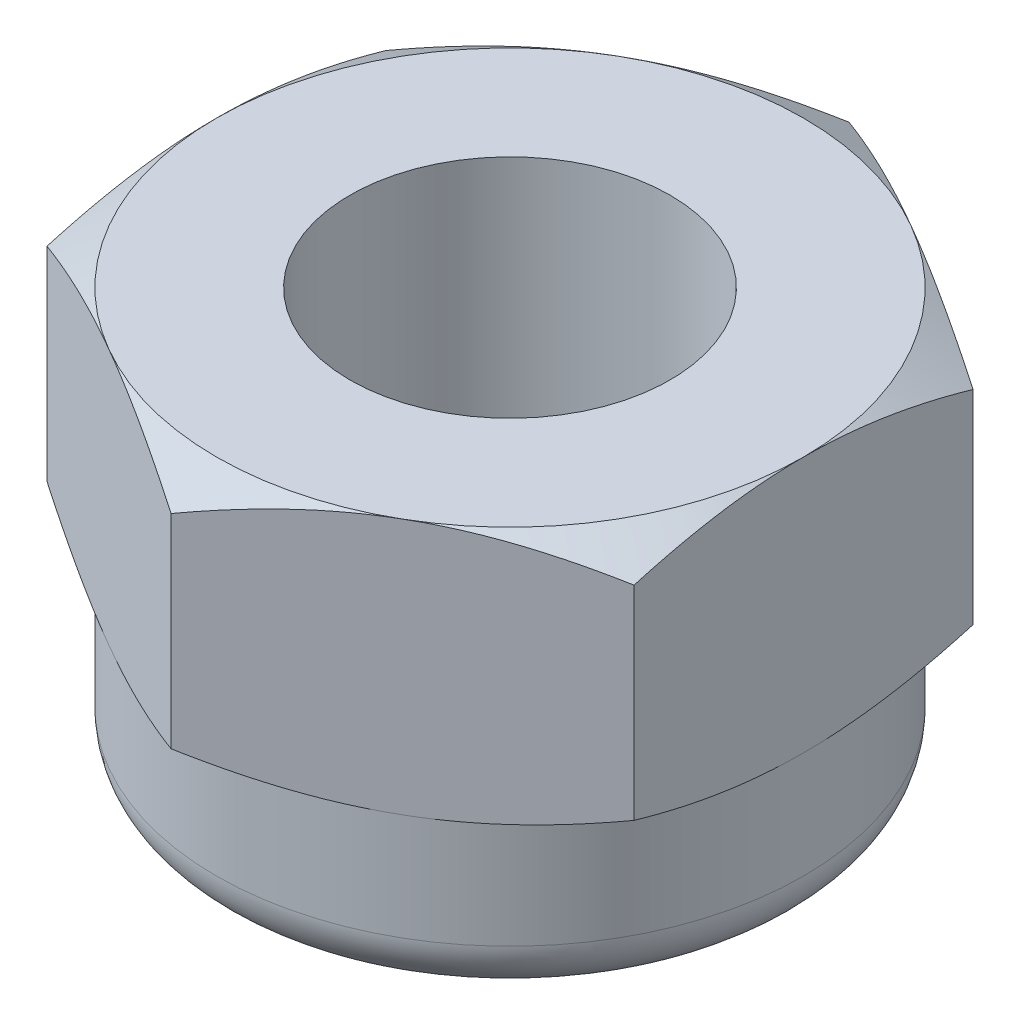
ISO-10303-21;
HEADER;
FILE_DESCRIPTION(('STEP AP214'),'2;1');
FILE_NAME('part.step','',(''),(''),'','','');
FILE_SCHEMA(('AUTOMOTIVE_DESIGN { 1 0 10303 214 1 1 1 1 }'));
ENDSEC;
DATA;
#1=APPLICATION_CONTEXT('core data for automotive mechanical design processes');
#2=APPLICATION_PROTOCOL_DEFINITION('international standard','automotive_design',2000,#1);
#3=PRODUCT_CONTEXT('',#1,'mechanical');
#4=PRODUCT('Part','Part','',(#3));
#5=PRODUCT_RELATED_PRODUCT_CATEGORY('part','',(#4));
#6=PRODUCT_DEFINITION_FORMATION('','',#4);
#7=PRODUCT_DEFINITION_CONTEXT('part definition',#1,'design');
#8=PRODUCT_DEFINITION('design','',#6,#7);
#9=PRODUCT_DEFINITION_SHAPE('','',#8);
#10=(LENGTH_UNIT() NAMED_UNIT(*) SI_UNIT(.MILLI.,.METRE.));
#11=(NAMED_UNIT(*) PLANE_ANGLE_UNIT() SI_UNIT($,.RADIAN.));
#12=(NAMED_UNIT(*) SI_UNIT($,.STERADIAN.) SOLID_ANGLE_UNIT());
#13=UNCERTAINTY_MEASURE_WITH_UNIT(LENGTH_MEASURE(1.E-05),#10,'distance_accuracy_value','');
#14=(GEOMETRIC_REPRESENTATION_CONTEXT(3) GLOBAL_UNCERTAINTY_ASSIGNED_CONTEXT((#13)) GLOBAL_UNIT_ASSIGNED_CONTEXT((#10,
#11,#12)) REPRESENTATION_CONTEXT('',''));
#15=CARTESIAN_POINT('',(0.,0.,0.));
#16=DIRECTION('',(0.,0.,1.));
#17=DIRECTION('',(1.,0.,0.));
#18=AXIS2_PLACEMENT_3D('',#15,#16,#17);
#19=CARTESIAN_POINT('',(2.75,2.4,1.58771324027147));
#20=DIRECTION('',(-1.,0.,0.));
#21=DIRECTION('',(0.,0.,1.));
#22=AXIS2_PLACEMENT_3D('',#19,#20,#21);
#23=PLANE('',#22);
#24=CARTESIAN_POINT('',(2.75,1.38093653958842,-4.34466851973618));
#25=CARTESIAN_POINT('',(2.75,1.32202064950724,-4.22386779698329));
#26=CARTESIAN_POINT('',(2.75,1.26364700999931,-4.10279820576392));
#27=CARTESIAN_POINT('',(2.75,1.1482876774291,-3.85997860192461));
#28=CARTESIAN_POINT('',(2.75,1.09130218842708,-3.73822849246315));
#29=CARTESIAN_POINT('',(2.75,0.978752723293784,-3.49331526441921));
#30=CARTESIAN_POINT('',(2.75,0.923197515155514,-3.37014810316777));
#31=CARTESIAN_POINT('',(2.75,0.814256244023592,-3.12286173431569));
#32=CARTESIAN_POINT('',(2.75,0.760870083644362,-2.99874256975606));
#33=CARTESIAN_POINT('',(2.75,0.655040057447402,-2.74504756832828));
#34=CARTESIAN_POINT('',(2.75,0.602692465793723,-2.61543135851998));
#35=CARTESIAN_POINT('',(2.75,0.501769184528042,-2.3547122248499));
#36=CARTESIAN_POINT('',(2.75,0.453193906922891,-2.22360914038081));
#37=CARTESIAN_POINT('',(2.75,0.361032320926382,-1.95992838631145));
#38=CARTESIAN_POINT('',(2.75,0.317436563028728,-1.82735405172156));
#39=CARTESIAN_POINT('',(2.75,0.236579903230571,-1.56030503468424));
#40=CARTESIAN_POINT('',(2.75,0.19931708834281,-1.42583093943772));
#41=CARTESIAN_POINT('',(2.75,0.133064720744649,-1.15567205992232));
#42=CARTESIAN_POINT('',(2.75,0.104027276748661,-1.01999923443433));
#43=CARTESIAN_POINT('',(2.75,0.0558064271323424,-0.746885455758029));
#44=CARTESIAN_POINT('',(2.75,0.0366219648340762,-0.60944469379236));
#45=CARTESIAN_POINT('',(2.75,0.00988438809777795,-0.335308015782439));
#46=CARTESIAN_POINT('',(2.75,0.00217562219202478,-0.198627665157731));
#47=CARTESIAN_POINT('',(2.75,-0.00137225152806838,0.0749013422897881));
#48=CARTESIAN_POINT('',(2.75,0.00278868640387943,0.211749999759228));
#49=CARTESIAN_POINT('',(2.75,0.0194575166846124,0.441773738270723));
#50=CARTESIAN_POINT('',(2.75,0.0289378796806115,0.535183717161858));
#51=CARTESIAN_POINT('',(2.75,0.0528801300146092,0.721369109747204));
#52=CARTESIAN_POINT('',(2.75,0.0673426297137115,0.814144444006141));
#53=CARTESIAN_POINT('',(2.75,0.117450471333739,1.09135512594781));
#54=CARTESIAN_POINT('',(2.75,0.159808531169033,1.27458276750907));
#55=CARTESIAN_POINT('',(2.75,0.258901006196716,1.64148663937185));
#56=CARTESIAN_POINT('',(2.75,0.315943538456145,1.82507634432752));
#57=CARTESIAN_POINT('',(2.75,0.408810753757667,2.09789707107598));
#58=CARTESIAN_POINT('',(2.75,0.440981048739553,2.1884033337036));
#59=CARTESIAN_POINT('',(2.75,0.507377444516064,2.3686579485815));
#60=CARTESIAN_POINT('',(2.75,0.541603508874817,2.45840631423238));
#61=CARTESIAN_POINT('',(2.75,0.630917375568817,2.68603060571207));
#62=CARTESIAN_POINT('',(2.75,0.68719551496508,2.82343831755756));
#63=CARTESIAN_POINT('',(2.75,0.80288289071563,3.09693392822121));
#64=CARTESIAN_POINT('',(2.75,0.862292397407978,3.23302171188218));
#65=CARTESIAN_POINT('',(2.75,0.983551766352992,3.50414955291982));
#66=CARTESIAN_POINT('',(2.75,1.04540233123311,3.63918929504804));
#67=CARTESIAN_POINT('',(2.75,1.17101091756355,3.90838031374438));
#68=CARTESIAN_POINT('',(2.75,1.23476899108964,4.04253156593401));
#69=CARTESIAN_POINT('',(2.75,1.42847314195054,4.44426655928707));
#70=CARTESIAN_POINT('',(2.75,1.56067980896763,4.71075917718014));
#71=CARTESIAN_POINT('',(2.75,1.82899066695537,5.24170253784736));
#72=CARTESIAN_POINT('',(2.75,1.96509418383273,5.50615362384513));
#73=CARTESIAN_POINT('',(2.75,2.22681256839317,6.00831212761472));
#74=CARTESIAN_POINT('',(2.75,2.35217952114007,6.24614899547915));
#75=CARTESIAN_POINT('',(2.75,2.60455330317852,6.72096498096079));
#76=CARTESIAN_POINT('',(2.75,2.73156021492778,6.95794405467475));
#77=CARTESIAN_POINT('',(2.75,2.98641132805265,7.43050913308615));
#78=CARTESIAN_POINT('',(2.75,3.11425174665986,7.66609718039577));
#79=CARTESIAN_POINT('',(2.75,3.37088488435897,8.13673291173544));
#80=CARTESIAN_POINT('',(2.75,3.49967753635213,8.37178063233783));
#81=CARTESIAN_POINT('',(2.75,3.62882004293521,8.60663456203462));
#82=B_SPLINE_CURVE_WITH_KNOTS('',3,(#24,#25,#26,#27,#28,#29,#30,#31,#32,#33,#34,#35,#36,#37,#38,
#39,#40,#41,#42,#43,#44,#45,#46,#47,#48,#49,#50,#51,#52,#53,#54,#55,#56,#57,#58,#59,#60,#61,#62,
#63,#64,#65,#66,#67,#68,#69,#70,#71,#72,#73,#74,#75,#76,#77,#78,#79,#80,#81),.UNSPECIFIED.,.F.,
.F.,(4,2,2,2,2,2,2,2,2,2,2,2,2,2,2,2,2,2,2,2,2,2,2,2,2,2,2,2,4),(0.,0.403210544384673,
0.806480007959045,1.21181340797903,1.61712858924554,2.03644659555967,2.45581033497737,
2.87436455094914,3.29279210898127,3.70873084748665,4.1246249695373,4.53482498455775,
4.94502658050672,5.22656210678562,5.50813224932743,6.07154932122723,6.64791901572732,
6.93606075698111,7.22419739279862,7.66960137467362,8.11504387247217,8.56061553390865,
9.00619937075532,9.89859388845236,10.7908349577555,11.5973926448137,12.4039910450292,
13.2081055813639,14.0121639860803),.UNSPECIFIED.);
#83=CARTESIAN_POINT('',(2.75,0.2456200930618,-1.58771324027157));
#84=VERTEX_POINT('',#83);
#85=CARTESIAN_POINT('',(2.75,0.,0.));
#86=VERTEX_POINT('',#85);
#87=EDGE_CURVE('E150',#84,#86,#82,.T.);
#88=ORIENTED_EDGE('',*,*,#87,.F.);
#89=DIRECTION('',(0.,-1.,0.));
#90=VECTOR('',#89,1.);
#91=CARTESIAN_POINT('',(2.75,2.4,-1.58771324027147));
#92=LINE('',#91,#90);
#93=CARTESIAN_POINT('',(2.75,2.15437990693814,-1.58771324027147));
#94=VERTEX_POINT('',#93);
#95=EDGE_CURVE('E159',#94,#84,#92,.T.);
#96=ORIENTED_EDGE('',*,*,#95,.F.);
#97=CARTESIAN_POINT('',(2.75,1.0190634604116,-4.34466851973617));
#98=CARTESIAN_POINT('',(2.75,1.07797935049279,-4.22386779698328));
#99=CARTESIAN_POINT('',(2.75,1.13635299000071,-4.10279820576391));
#100=CARTESIAN_POINT('',(2.75,1.25171232257092,-3.8599786019246));
#101=CARTESIAN_POINT('',(2.75,1.30869781157294,-3.73822849246315));
#102=CARTESIAN_POINT('',(2.75,1.42124727670624,-3.4933152644192));
#103=CARTESIAN_POINT('',(2.75,1.4768024848445,-3.37014810316777));
#104=CARTESIAN_POINT('',(2.75,1.58574375597643,-3.12286173431569));
#105=CARTESIAN_POINT('',(2.75,1.63912991635565,-2.99874256975605));
#106=CARTESIAN_POINT('',(2.75,1.74495994255261,-2.74504756832828));
#107=CARTESIAN_POINT('',(2.75,1.79730753420629,-2.61543135851997));
#108=CARTESIAN_POINT('',(2.75,1.89823081547197,-2.35471222484989));
#109=CARTESIAN_POINT('',(2.75,1.94680609307712,-2.22360914038081));
#110=CARTESIAN_POINT('',(2.75,2.03896767907362,-1.95992838631144));
#111=CARTESIAN_POINT('',(2.75,2.08256343697128,-1.82735405172156));
#112=CARTESIAN_POINT('',(2.75,2.16342009676943,-1.56030503468424));
#113=CARTESIAN_POINT('',(2.75,2.20068291165719,-1.42583093943771));
#114=CARTESIAN_POINT('',(2.75,2.26693527925535,-1.15567205992232));
#115=CARTESIAN_POINT('',(2.75,2.29597272325134,-1.01999923443432));
#116=CARTESIAN_POINT('',(2.75,2.34419357286766,-0.746885455758027));
#117=CARTESIAN_POINT('',(2.75,2.36337803516592,-0.609444693792358));
#118=CARTESIAN_POINT('',(2.75,2.39011561190222,-0.335308015782438));
#119=CARTESIAN_POINT('',(2.75,2.39782437780797,-0.198627665157731));
#120=CARTESIAN_POINT('',(2.75,2.40137225152807,0.0749013422897874));
#121=CARTESIAN_POINT('',(2.75,2.39721131359612,0.211749999759227));
#122=CARTESIAN_POINT('',(2.75,2.38054248331539,0.441773738270724));
#123=CARTESIAN_POINT('',(2.75,2.37106212031939,0.53518371716186));
#124=CARTESIAN_POINT('',(2.75,2.34711986998539,0.72136910974721));
#125=CARTESIAN_POINT('',(2.75,2.33265737028629,0.81414444400615));
#126=CARTESIAN_POINT('',(2.75,2.28254952866626,1.09135512594783));
#127=CARTESIAN_POINT('',(2.75,2.24019146883096,1.27458276750909));
#128=CARTESIAN_POINT('',(2.75,2.14109899380328,1.64148663937188));
#129=CARTESIAN_POINT('',(2.75,2.08405646154385,1.82507634432755));
#130=CARTESIAN_POINT('',(2.75,1.99118924624233,2.09789707107601));
#131=CARTESIAN_POINT('',(2.75,1.95901895126044,2.18840333370364));
#132=CARTESIAN_POINT('',(2.75,1.89262255548393,2.36865794858154));
#133=CARTESIAN_POINT('',(2.75,1.85839649112518,2.45840631423243));
#134=CARTESIAN_POINT('',(2.75,1.76908262443118,2.68603060571212));
#135=CARTESIAN_POINT('',(2.75,1.71280448503491,2.82343831755761));
#136=CARTESIAN_POINT('',(2.75,1.59711710928437,3.09693392822125));
#137=CARTESIAN_POINT('',(2.75,1.53770760259202,3.23302171188222));
#138=CARTESIAN_POINT('',(2.75,1.41644823364701,3.50414955291986));
#139=CARTESIAN_POINT('',(2.75,1.35459766876689,3.63918929504808));
#140=CARTESIAN_POINT('',(2.75,1.22898908243645,3.90838031374441));
#141=CARTESIAN_POINT('',(2.75,1.16523100891036,4.04253156593405));
#142=CARTESIAN_POINT('',(2.75,0.971526858049471,4.44426655928711));
#143=CARTESIAN_POINT('',(2.75,0.839320191032382,4.71075917718017));
#144=CARTESIAN_POINT('',(2.75,0.571009333044648,5.24170253784739));
#145=CARTESIAN_POINT('',(2.75,0.434905816167286,5.50615362384516));
#146=CARTESIAN_POINT('',(2.75,0.173187431606851,6.00831212761475));
#147=CARTESIAN_POINT('',(2.75,0.0478204788599523,6.24614899547918));
#148=CARTESIAN_POINT('',(2.75,-0.204553303178489,6.72096498096082));
#149=CARTESIAN_POINT('',(2.75,-0.331560214927753,6.95794405467478));
#150=CARTESIAN_POINT('',(2.75,-0.58641132805262,7.43050913308618));
#151=CARTESIAN_POINT('',(2.75,-0.714251746659824,7.6660971803958));
#152=CARTESIAN_POINT('',(2.75,-0.970884884358933,8.13673291173547));
#153=CARTESIAN_POINT('',(2.75,-1.09967753635209,8.37178063233787));
#154=CARTESIAN_POINT('',(2.75,-1.22882004293517,8.60663456203465));
#155=B_SPLINE_CURVE_WITH_KNOTS('',3,(#97,#98,#99,#100,#101,#102,#103,#104,#105,#106,#107,#108,
#109,#110,#111,#112,#113,#114,#115,#116,#117,#118,#119,#120,#121,#122,#123,#124,#125,#126,#127,
#128,#129,#130,#131,#132,#133,#134,#135,#136,#137,#138,#139,#140,#141,#142,#143,#144,#145,#146,
#147,#148,#149,#150,#151,#152,#153,#154),.UNSPECIFIED.,.F.,.F.,(4,2,2,2,2,2,2,2,2,2,2,2,2,2,2,2,
2,2,2,2,2,2,2,2,2,2,2,2,4),(0.,0.403210544384672,0.806480007959044,1.21181340797902,
1.61712858924554,2.03644659555967,2.45581033497736,2.87436455094913,3.29279210898126,
3.70873084748664,4.12462496953729,4.53482498455774,4.94502658050671,5.22656210678561,
5.50813224932743,6.07154932122724,6.64791901572734,6.93606075698114,7.22419739279866,
7.66960137467366,8.1150438724722,8.56061553390868,9.00619937075534,9.89859388845238,
10.7908349577555,11.5973926448137,12.4039910450292,13.2081055813639,14.0121639860803),.UNSPECIFIED.);
#156=CARTESIAN_POINT('',(2.75,2.4,0.));
#157=VERTEX_POINT('',#156);
#158=EDGE_CURVE('E224',#157,#94,#155,.F.);
#159=ORIENTED_EDGE('',*,*,#158,.F.);
#160=CARTESIAN_POINT('',(2.75,2.15437990693814,1.58771324027147));
#161=VERTEX_POINT('',#160);
#162=EDGE_CURVE('E231',#161,#157,#155,.F.);
#163=ORIENTED_EDGE('',*,*,#162,.F.);
#164=DIRECTION('',(0.,-1.,0.));
#165=VECTOR('',#164,1.);
#166=CARTESIAN_POINT('',(2.75,2.4,1.58771324027147));
#167=LINE('',#166,#165);
#168=CARTESIAN_POINT('',(2.75,0.245620093061864,1.58771324027147));
#169=VERTEX_POINT('',#168);
#170=EDGE_CURVE('E242',#161,#169,#167,.T.);
#171=ORIENTED_EDGE('',*,*,#170,.T.);
#172=EDGE_CURVE('E214',#86,#169,#82,.T.);
#173=ORIENTED_EDGE('',*,*,#172,.F.);
#174=EDGE_LOOP('',(#88,#96,#159,#163,#171,#173));
#175=FACE_BOUND('',#174,.T.);
#176=ADVANCED_FACE('F38',(#175),#23,.F.);
#177=CARTESIAN_POINT('',(2.75,2.4,-1.58771324027147));
#178=DIRECTION('',(-0.5,0.,0.866025403784439));
#179=DIRECTION('',(0.866025403784439,0.,0.5));
#180=AXIS2_PLACEMENT_3D('',#177,#178,#179);
#181=PLANE('',#180);
#182=CARTESIAN_POINT('',(-0.000200000000000501,0.245686763364762,-3.17554195059678));
#183=CARTESIAN_POINT('',(0.120649220659906,0.205387662249264,-3.10576962051743));
#184=CARTESIAN_POINT('',(0.242541602622634,0.168736902597663,-3.03539502097908));
#185=CARTESIAN_POINT('',(0.488437126727893,0.104762182969802,-2.89342717394439));
#186=CARTESIAN_POINT('',(0.612444638573856,0.0774608556744981,-2.82183140359858));
#187=CARTESIAN_POINT('',(0.858922797975945,0.0349617452941173,-2.67952717191842));
#188=CARTESIAN_POINT('',(0.981355518587418,0.0194811186224583,-2.60884060771577));
#189=CARTESIAN_POINT('',(1.22679714236892,0.000999397369940745,-2.46713482015518));
#190=CARTESIAN_POINT('',(1.34980515323291,-0.00201700053740013,-2.39611611197037));
#191=CARTESIAN_POINT('',(1.57965878661079,0.0042531454285469,-2.26341005486544));
#192=CARTESIAN_POINT('',(1.68653879125402,0.0120001542767027,-2.20170285541369));
#193=CARTESIAN_POINT('',(1.89960246733475,0.0365551810643553,-2.07869048467395));
#194=CARTESIAN_POINT('',(2.00578540164889,0.053371589650571,-2.01738573896433));
#195=CARTESIAN_POINT('',(2.21928848939318,0.0954119223459572,-1.89411967378235));
#196=CARTESIAN_POINT('',(2.32658161614285,0.120814080687232,-1.83217395817123));
#197=CARTESIAN_POINT('',(2.53956747928405,0.178467225839983,-1.70920651275308));
#198=CARTESIAN_POINT('',(2.64526294502665,0.210704663298984,-1.64818320715446));
#199=CARTESIAN_POINT('',(2.7502,0.245686763364762,-1.58759777021763));
#200=B_SPLINE_CURVE_WITH_KNOTS('',3,(#182,#183,#184,#185,#186,#187,#188,#189,#190,#191,#192,
#193,#194,#195,#196,#197,#198,#199),.UNSPECIFIED.,.F.,.F.,(4,2,2,2,2,2,2,2,4),(0.,
0.435912828725889,0.872873557116333,1.29901931904672,1.72464171213574,2.09526089052938,
2.46622354066374,2.84541551798557,3.22386274754524),.UNSPECIFIED.);
#201=CARTESIAN_POINT('',(0.,0.245620093061864,-3.17542648054294));
#202=VERTEX_POINT('',#201);
#203=CARTESIAN_POINT('',(1.375,0.,-2.38156986040721));
#204=VERTEX_POINT('',#203);
#205=EDGE_CURVE('E137',#202,#204,#200,.T.);
#206=ORIENTED_EDGE('',*,*,#205,.F.);
#207=DIRECTION('',(0.,-1.,0.));
#208=VECTOR('',#207,1.);
#209=CARTESIAN_POINT('',(0.,2.4,-3.17542648054294));
#210=LINE('',#209,#208);
#211=CARTESIAN_POINT('',(0.,2.15437990693814,-3.17542648054294));
#212=VERTEX_POINT('',#211);
#213=EDGE_CURVE('E254',#212,#202,#210,.T.);
#214=ORIENTED_EDGE('',*,*,#213,.F.);
#215=CARTESIAN_POINT('',(2.7502,2.15431323663524,-1.58759777021763));
#216=CARTESIAN_POINT('',(2.62935077934009,2.19461233775074,-1.65737010029699));
#217=CARTESIAN_POINT('',(2.50745839737737,2.23126309740234,-1.72774469983533));
#218=CARTESIAN_POINT('',(2.26156287327211,2.2952378170302,-1.86971254687003));
#219=CARTESIAN_POINT('',(2.13755536142614,2.3225391443255,-1.94130831721583));
#220=CARTESIAN_POINT('',(1.89107720202406,2.36503825470588,-2.08361254889599));
#221=CARTESIAN_POINT('',(1.76864448141258,2.38051888137754,-2.15429911309864));
#222=CARTESIAN_POINT('',(1.52320285763109,2.39900060263006,-2.29600490065923));
#223=CARTESIAN_POINT('',(1.40019484676709,2.4020170005374,-2.36702360884404));
#224=CARTESIAN_POINT('',(1.17034121338921,2.39574685457145,-2.49972966594897));
#225=CARTESIAN_POINT('',(1.06346120874598,2.3879998457233,-2.56143686540073));
#226=CARTESIAN_POINT('',(0.850397532665251,2.36344481893564,-2.68444923614047));
#227=CARTESIAN_POINT('',(0.744214598351111,2.34662841034943,-2.74575398185008));
#228=CARTESIAN_POINT('',(0.530711510606816,2.30458807765404,-2.86902004703206));
#229=CARTESIAN_POINT('',(0.423418383857145,2.27918591931277,-2.93096576264318));
#230=CARTESIAN_POINT('',(0.210432520715948,2.22153277416002,-3.05393320806134));
#231=CARTESIAN_POINT('',(0.104737054973347,2.18929533670102,-3.11495651365995));
#232=CARTESIAN_POINT('',(-0.000200000000000682,2.15431323663524,-3.17554195059678));
#233=B_SPLINE_CURVE_WITH_KNOTS('',3,(#215,#216,#217,#218,#219,#220,#221,#222,#223,#224,#225,
#226,#227,#228,#229,#230,#231,#232),.UNSPECIFIED.,.F.,.F.,(4,2,2,2,2,2,2,2,4),(0.,
0.435912828725888,0.872873557116331,1.29901931904671,1.72464171213573,2.09526089052937,
2.46622354066374,2.84541551798557,3.22386274754524),.UNSPECIFIED.);
#234=CARTESIAN_POINT('',(1.375,2.4,-2.38156986040721));
#235=VERTEX_POINT('',#234);
#236=EDGE_CURVE('E233',#235,#212,#233,.T.);
#237=ORIENTED_EDGE('',*,*,#236,.F.);
#238=EDGE_CURVE('E232',#94,#235,#233,.T.);
#239=ORIENTED_EDGE('',*,*,#238,.F.);
#240=ORIENTED_EDGE('',*,*,#95,.T.);
#241=EDGE_CURVE('E145',#204,#84,#200,.T.);
#242=ORIENTED_EDGE('',*,*,#241,.F.);
#243=EDGE_LOOP('',(#206,#214,#237,#239,#240,#242));
#244=FACE_BOUND('',#243,.T.);
#245=ADVANCED_FACE('F156',(#244),#181,.F.);
#246=CARTESIAN_POINT('',(0.,2.4,-3.17542648054294));
#247=DIRECTION('',(0.5,0.,0.866025403784439));
#248=DIRECTION('',(0.866025403784439,0.,-0.5));
#249=AXIS2_PLACEMENT_3D('',#246,#247,#248);
#250=PLANE('',#249);
#251=CARTESIAN_POINT('',(-2.7502,0.245686763364762,-1.58759777021763));
#252=CARTESIAN_POINT('',(-2.62935077934009,0.205387662249264,-1.65737010029699));
#253=CARTESIAN_POINT('',(-2.50745839737737,0.168736902597663,-1.72774469983533));
#254=CARTESIAN_POINT('',(-2.26156287327211,0.104762182969802,-1.86971254687003));
#255=CARTESIAN_POINT('',(-2.13755536142614,0.0774608556744982,-1.94130831721583));
#256=CARTESIAN_POINT('',(-1.89107720202405,0.0349617452941174,-2.08361254889599));
#257=CARTESIAN_POINT('',(-1.76864448141258,0.0194811186224582,-2.15429911309864));
#258=CARTESIAN_POINT('',(-1.52320285763108,0.00099939736994089,-2.29600490065923));
#259=CARTESIAN_POINT('',(-1.40019484676709,-0.00201700053739971,-2.36702360884404));
#260=CARTESIAN_POINT('',(-1.1703412133892,0.0042531454285476,-2.49972966594897));
#261=CARTESIAN_POINT('',(-1.06346120874598,0.0120001542767034,-2.56143686540073));
#262=CARTESIAN_POINT('',(-0.850397532665249,0.036555181064356,-2.68444923614047));
#263=CARTESIAN_POINT('',(-0.744214598351109,0.0533715896505715,-2.74575398185008));
#264=CARTESIAN_POINT('',(-0.530711510606815,0.0954119223459576,-2.86902004703206));
#265=CARTESIAN_POINT('',(-0.423418383857144,0.120814080687232,-2.93096576264318));
#266=CARTESIAN_POINT('',(-0.210432520715949,0.178467225839983,-3.05393320806134));
#267=CARTESIAN_POINT('',(-0.104737054973347,0.210704663298984,-3.11495651365995));
#268=CARTESIAN_POINT('',(0.000199999999999406,0.245686763364762,-3.17554195059678));
#269=B_SPLINE_CURVE_WITH_KNOTS('',3,(#251,#252,#253,#254,#255,#256,#257,#258,#259,#260,#261,
#262,#263,#264,#265,#266,#267,#268),.UNSPECIFIED.,.F.,.F.,(4,2,2,2,2,2,2,2,4),(0.,
0.435912828725889,0.872873557116334,1.29901931904672,1.72464171213574,2.09526089052938,
2.46622354066374,2.84541551798557,3.22386274754524),.UNSPECIFIED.);
#270=CARTESIAN_POINT('',(-2.75,0.245620093061801,-1.58771324027157));
#271=VERTEX_POINT('',#270);
#272=CARTESIAN_POINT('',(-1.375,0.,-2.38156986040721));
#273=VERTEX_POINT('',#272);
#274=EDGE_CURVE('E311',#271,#273,#269,.T.);
#275=ORIENTED_EDGE('',*,*,#274,.F.);
#276=DIRECTION('',(0.,-1.,0.));
#277=VECTOR('',#276,1.);
#278=CARTESIAN_POINT('',(-2.75,2.4,-1.58771324027147));
#279=LINE('',#278,#277);
#280=CARTESIAN_POINT('',(-2.75,2.1543799069382,-1.58771324027157));
#281=VERTEX_POINT('',#280);
#282=EDGE_CURVE('E251',#281,#271,#279,.T.);
#283=ORIENTED_EDGE('',*,*,#282,.F.);
#284=CARTESIAN_POINT('',(0.000199999999999509,2.15431323663524,-3.17554195059678));
#285=CARTESIAN_POINT('',(-0.120649220659906,2.19461233775074,-3.10576962051743));
#286=CARTESIAN_POINT('',(-0.242541602622634,2.23126309740234,-3.03539502097908));
#287=CARTESIAN_POINT('',(-0.488437126727893,2.2952378170302,-2.89342717394439));
#288=CARTESIAN_POINT('',(-0.612444638573855,2.3225391443255,-2.82183140359858));
#289=CARTESIAN_POINT('',(-0.858922797975944,2.36503825470588,-2.67952717191843));
#290=CARTESIAN_POINT('',(-0.981355518587417,2.38051888137754,-2.60884060771577));
#291=CARTESIAN_POINT('',(-1.22679714236892,2.39900060263006,-2.46713482015519));
#292=CARTESIAN_POINT('',(-1.34980515323291,2.4020170005374,-2.39611611197038));
#293=CARTESIAN_POINT('',(-1.57965878661079,2.39574685457145,-2.26341005486544));
#294=CARTESIAN_POINT('',(-1.68653879125402,2.3879998457233,-2.20170285541369));
#295=CARTESIAN_POINT('',(-1.89960246733475,2.36344481893564,-2.07869048467395));
#296=CARTESIAN_POINT('',(-2.00578540164889,2.34662841034943,-2.01738573896434));
#297=CARTESIAN_POINT('',(-2.21928848939318,2.30458807765404,-1.89411967378235));
#298=CARTESIAN_POINT('',(-2.32658161614285,2.27918591931277,-1.83217395817123));
#299=CARTESIAN_POINT('',(-2.53956747928405,2.22153277416002,-1.70920651275308));
#300=CARTESIAN_POINT('',(-2.64526294502665,2.18929533670102,-1.64818320715446));
#301=CARTESIAN_POINT('',(-2.7502,2.15431323663524,-1.58759777021763));
#302=B_SPLINE_CURVE_WITH_KNOTS('',3,(#284,#285,#286,#287,#288,#289,#290,#291,#292,#293,#294,
#295,#296,#297,#298,#299,#300,#301),.UNSPECIFIED.,.F.,.F.,(4,2,2,2,2,2,2,2,4),(0.,
0.435912828725888,0.872873557116331,1.29901931904671,1.72464171213573,2.09526089052937,
2.46622354066374,2.84541551798557,3.22386274754524),.UNSPECIFIED.);
#303=CARTESIAN_POINT('',(-1.375,2.4,-2.38156986040721));
#304=VERTEX_POINT('',#303);
#305=EDGE_CURVE('E293',#304,#281,#302,.T.);
#306=ORIENTED_EDGE('',*,*,#305,.F.);
#307=EDGE_CURVE('E298',#212,#304,#302,.T.);
#308=ORIENTED_EDGE('',*,*,#307,.F.);
#309=ORIENTED_EDGE('',*,*,#213,.T.);
#310=EDGE_CURVE('E139',#273,#202,#269,.T.);
#311=ORIENTED_EDGE('',*,*,#310,.F.);
#312=EDGE_LOOP('',(#275,#283,#306,#308,#309,#311));
#313=FACE_BOUND('',#312,.T.);
#314=ADVANCED_FACE('F299',(#313),#250,.F.);
#315=CARTESIAN_POINT('',(-2.75,2.4,-1.58771324027147));
#316=DIRECTION('',(1.,0.,0.));
#317=DIRECTION('',(0.,0.,-1.));
#318=AXIS2_PLACEMENT_3D('',#315,#316,#317);
#319=PLANE('',#318);
#320=CARTESIAN_POINT('',(-2.75,1.38093653748996,-4.34466851543462));
#321=CARTESIAN_POINT('',(-2.75,1.32202064749606,-4.22386779282652));
#322=CARTESIAN_POINT('',(-2.75,1.26364700807538,-4.10279820175204));
#323=CARTESIAN_POINT('',(-2.75,1.14828767567924,-3.85997859820295));
#324=CARTESIAN_POINT('',(-2.75,1.09130218676404,-3.73822848888681));
#325=CARTESIAN_POINT('',(-2.75,0.978752721804428,-3.49331526113567));
#326=CARTESIAN_POINT('',(-2.75,0.923197513753003,-3.37014810003173));
#327=CARTESIAN_POINT('',(-2.75,0.814256242793354,-3.1228617314756));
#328=CARTESIAN_POINT('',(-2.75,0.760870082499553,-2.99874256706443));
#329=CARTESIAN_POINT('',(-2.75,0.655040056476303,-2.74504756594581));
#330=CARTESIAN_POINT('',(-2.75,0.602692464910696,-2.61543135629829));
#331=CARTESIAN_POINT('',(-2.75,0.501769183816527,-2.35471222295232));
#332=CARTESIAN_POINT('',(-2.75,0.453193906294815,-2.22360913864656));
#333=CARTESIAN_POINT('',(-2.75,0.361032320457336,-1.95992838490687));
#334=CARTESIAN_POINT('',(-2.75,0.317436562635296,-1.82735405048331));
#335=CARTESIAN_POINT('',(-2.75,0.236579902976239,-1.56030503378314));
#336=CARTESIAN_POINT('',(-2.75,0.19931708815197,-1.42583093870743));
#337=CARTESIAN_POINT('',(-2.75,0.133064720682126,-1.1556720596198));
#338=CARTESIAN_POINT('',(-2.75,0.104027276746228,-1.01999923438993));
#339=CARTESIAN_POINT('',(-2.75,0.055806427211385,-0.746885456236263));
#340=CARTESIAN_POINT('',(-2.75,0.0366219649345325,-0.609444694535094));
#341=CARTESIAN_POINT('',(-2.75,0.00988438819379742,-0.335308017049834));
#342=CARTESIAN_POINT('',(-2.75,0.00217562226308941,-0.198627666685229));
#343=CARTESIAN_POINT('',(-2.75,-0.00137225155275876,0.074901340245865));
#344=CARTESIAN_POINT('',(-2.75,0.00278868630837897,0.211749997458983));
#345=CARTESIAN_POINT('',(-2.75,0.0194575164456932,0.441773735650865));
#346=CARTESIAN_POINT('',(-2.75,0.0289378793850352,0.535183714475791));
#347=CARTESIAN_POINT('',(-2.75,0.052880129602743,0.721369106931753));
#348=CARTESIAN_POINT('',(-2.75,0.0673426292422119,0.814144441127516));
#349=CARTESIAN_POINT('',(-2.75,0.117450470682125,1.09135512288322));
#350=CARTESIAN_POINT('',(-2.75,0.159808530395801,1.27458276432552));
#351=CARTESIAN_POINT('',(-2.75,0.258901005183362,1.64148663594934));
#352=CARTESIAN_POINT('',(-2.75,0.315943537324215,1.82507634078515));
#353=CARTESIAN_POINT('',(-2.75,0.408810752454266,2.09789706735471));
#354=CARTESIAN_POINT('',(-2.75,0.440981047380104,2.18840332992296));
#355=CARTESIAN_POINT('',(-2.75,0.507377443046531,2.36865794468211));
#356=CARTESIAN_POINT('',(-2.75,0.541603507351248,2.45840631027363));
#357=CARTESIAN_POINT('',(-2.75,0.63091737395513,2.68603060171685));
#358=CARTESIAN_POINT('',(-2.75,0.687195513320008,2.8234383135838));
#359=CARTESIAN_POINT('',(-2.75,0.802882889016021,3.09693392428772));
#360=CARTESIAN_POINT('',(-2.75,0.862292395685221,3.2330217079675));
#361=CARTESIAN_POINT('',(-2.75,0.983551764590068,3.50414954904077));
#362=CARTESIAN_POINT('',(-2.75,1.04540232945317,3.6391892911858));
#363=CARTESIAN_POINT('',(-2.75,1.17101091575408,3.90838030991399));
#364=CARTESIAN_POINT('',(-2.75,1.23476898926765,4.04253156211866));
#365=CARTESIAN_POINT('',(-2.75,1.42847314009673,4.4442665555164));
#366=CARTESIAN_POINT('',(-2.75,1.56067980709955,4.71075917343698));
#367=CARTESIAN_POINT('',(-2.75,1.8289906650663,5.24170253415536));
#368=CARTESIAN_POINT('',(-2.75,1.96509418193694,5.5061536201768));
#369=CARTESIAN_POINT('',(-2.75,2.22681256648019,6.00831212397214));
#370=CARTESIAN_POINT('',(-2.75,2.35217951921604,6.24614899183894));
#371=CARTESIAN_POINT('',(-2.75,2.60455330123481,6.72096497732419));
#372=CARTESIAN_POINT('',(-2.75,2.73156021297546,6.95794405103938));
#373=CARTESIAN_POINT('',(-2.75,2.98641132608302,7.43050912944912));
#374=CARTESIAN_POINT('',(-2.75,3.11425174468152,7.66609717675587));
#375=CARTESIAN_POINT('',(-2.75,3.37088488236435,8.13673290808909));
#376=CARTESIAN_POINT('',(-2.75,3.49967753434993,8.37178062868791));
#377=CARTESIAN_POINT('',(-2.75,3.62882004092583,8.60663455838092));
#378=B_SPLINE_CURVE_WITH_KNOTS('',3,(#320,#321,#322,#323,#324,#325,#326,#327,#328,#329,#330,
#331,#332,#333,#334,#335,#336,#337,#338,#339,#340,#341,#342,#343,#344,#345,#346,#347,#348,#349,
#350,#351,#352,#353,#354,#355,#356,#357,#358,#359,#360,#361,#362,#363,#364,#365,#366,#367,#368,
#369,#370,#371,#372,#373,#374,#375,#376,#377),.UNSPECIFIED.,.F.,.F.,(4,2,2,2,2,2,2,2,2,2,2,2,2,
2,2,2,2,2,2,2,2,2,2,2,2,2,2,2,4),(0.,0.403210543879464,0.806480006948556,1.21181340645808,
1.61712858721417,2.03644659298216,2.45581033185353,2.8743645472807,3.29279210476866,
3.70873084248075,4.12462496373927,4.53482497798788,4.94502657316468,5.22656209922885,
5.5081322415559,6.07154931302527,6.64791900707559,6.93606074810517,7.22419738369845,
7.66960136559704,8.1150438634194,8.5606155248804,9.00619936175164,9.89859387950334,
10.7908349488603,11.5973926359093,12.4039910361159,13.2081055724305,14.0121639771266),.UNSPECIFIED.);
#379=CARTESIAN_POINT('',(-2.75,0.245620093061864,1.58771324027147));
#380=VERTEX_POINT('',#379);
#381=CARTESIAN_POINT('',(-2.75,0.,0.));
#382=VERTEX_POINT('',#381);
#383=EDGE_CURVE('E160',#380,#382,#378,.F.);
#384=ORIENTED_EDGE('',*,*,#383,.F.);
#385=DIRECTION('',(0.,-1.,0.));
#386=VECTOR('',#385,1.);
#387=CARTESIAN_POINT('',(-2.75,2.4,1.58771324027147));
#388=LINE('',#387,#386);
#389=CARTESIAN_POINT('',(-2.75,2.15437990693814,1.58771324027147));
#390=VERTEX_POINT('',#389);
#391=EDGE_CURVE('E248',#390,#380,#388,.T.);
#392=ORIENTED_EDGE('',*,*,#391,.F.);
#393=CARTESIAN_POINT('',(-2.75,1.01906346251007,-4.34466851543462));
#394=CARTESIAN_POINT('',(-2.75,1.07797935250396,-4.22386779282652));
#395=CARTESIAN_POINT('',(-2.75,1.13635299192464,-4.10279820175204));
#396=CARTESIAN_POINT('',(-2.75,1.25171232432079,-3.85997859820294));
#397=CARTESIAN_POINT('',(-2.75,1.30869781323598,-3.73822848888681));
#398=CARTESIAN_POINT('',(-2.75,1.42124727819559,-3.49331526113566));
#399=CARTESIAN_POINT('',(-2.75,1.47680248624701,-3.37014810003172));
#400=CARTESIAN_POINT('',(-2.75,1.58574375720666,-3.1228617314756));
#401=CARTESIAN_POINT('',(-2.75,1.63912991750046,-2.99874256706443));
#402=CARTESIAN_POINT('',(-2.75,1.74495994352371,-2.7450475659458));
#403=CARTESIAN_POINT('',(-2.75,1.79730753508932,-2.61543135629828));
#404=CARTESIAN_POINT('',(-2.75,1.89823081618348,-2.35471222295231));
#405=CARTESIAN_POINT('',(-2.75,1.94680609370519,-2.22360913864656));
#406=CARTESIAN_POINT('',(-2.75,2.03896767954267,-1.95992838490686));
#407=CARTESIAN_POINT('',(-2.75,2.08256343736471,-1.82735405048331));
#408=CARTESIAN_POINT('',(-2.75,2.16342009702377,-1.56030503378313));
#409=CARTESIAN_POINT('',(-2.75,2.20068291184803,-1.42583093870743));
#410=CARTESIAN_POINT('',(-2.75,2.26693527931788,-1.1556720596198));
#411=CARTESIAN_POINT('',(-2.75,2.29597272325377,-1.01999923438993));
#412=CARTESIAN_POINT('',(-2.75,2.34419357278862,-0.746885456236262));
#413=CARTESIAN_POINT('',(-2.75,2.36337803506547,-0.609444694535093));
#414=CARTESIAN_POINT('',(-2.75,2.3901156118062,-0.335308017049834));
#415=CARTESIAN_POINT('',(-2.75,2.39782437773691,-0.19862766668523));
#416=CARTESIAN_POINT('',(-2.75,2.40137225155276,0.0749013402458641));
#417=CARTESIAN_POINT('',(-2.75,2.39721131369162,0.211749997458982));
#418=CARTESIAN_POINT('',(-2.75,2.38054248355431,0.441773735650866));
#419=CARTESIAN_POINT('',(-2.75,2.37106212061496,0.535183714475793));
#420=CARTESIAN_POINT('',(-2.75,2.34711987039726,0.72136910693176));
#421=CARTESIAN_POINT('',(-2.75,2.33265737075779,0.814144441127524));
#422=CARTESIAN_POINT('',(-2.75,2.28254952931787,1.09135512288323));
#423=CARTESIAN_POINT('',(-2.75,2.2401914696042,1.27458276432554));
#424=CARTESIAN_POINT('',(-2.75,2.14109899481663,1.64148663594937));
#425=CARTESIAN_POINT('',(-2.75,2.08405646267578,1.82507634078518));
#426=CARTESIAN_POINT('',(-2.75,1.99118924754573,2.09789706735475));
#427=CARTESIAN_POINT('',(-2.75,1.95901895261989,2.188403329923));
#428=CARTESIAN_POINT('',(-2.75,1.89262255695346,2.36865794468215));
#429=CARTESIAN_POINT('',(-2.75,1.85839649264874,2.45840631027367));
#430=CARTESIAN_POINT('',(-2.75,1.76908262604486,2.6860306017169));
#431=CARTESIAN_POINT('',(-2.75,1.71280448667999,2.82343831358384));
#432=CARTESIAN_POINT('',(-2.75,1.59711711098397,3.09693392428776));
#433=CARTESIAN_POINT('',(-2.75,1.53770760431477,3.23302170796754));
#434=CARTESIAN_POINT('',(-2.75,1.41644823540993,3.50414954904082));
#435=CARTESIAN_POINT('',(-2.75,1.35459767054683,3.63918929118585));
#436=CARTESIAN_POINT('',(-2.75,1.22898908424592,3.90838030991403));
#437=CARTESIAN_POINT('',(-2.75,1.16523101073235,4.0425315621187));
#438=CARTESIAN_POINT('',(-2.75,0.971526859903277,4.44426655551644));
#439=CARTESIAN_POINT('',(-2.75,0.839320192900458,4.71075917343701));
#440=CARTESIAN_POINT('',(-2.75,0.571009334933713,5.2417025341554));
#441=CARTESIAN_POINT('',(-2.75,0.434905818063075,5.50615362017683));
#442=CARTESIAN_POINT('',(-2.75,0.173187433519825,6.00831212397217));
#443=CARTESIAN_POINT('',(-2.75,0.0478204807839824,6.24614899183898));
#444=CARTESIAN_POINT('',(-2.75,-0.204553301234785,6.72096497732422));
#445=CARTESIAN_POINT('',(-2.75,-0.331560212975432,6.95794405103942));
#446=CARTESIAN_POINT('',(-2.75,-0.58641132608299,7.43050912944915));
#447=CARTESIAN_POINT('',(-2.75,-0.714251744681479,7.6660971767559));
#448=CARTESIAN_POINT('',(-2.75,-0.970884882364307,8.13673290808912));
#449=CARTESIAN_POINT('',(-2.75,-1.09967753434989,8.37178062868794));
#450=CARTESIAN_POINT('',(-2.75,-1.22882004092578,8.60663455838095));
#451=B_SPLINE_CURVE_WITH_KNOTS('',3,(#393,#394,#395,#396,#397,#398,#399,#400,#401,#402,#403,
#404,#405,#406,#407,#408,#409,#410,#411,#412,#413,#414,#415,#416,#417,#418,#419,#420,#421,#422,
#423,#424,#425,#426,#427,#428,#429,#430,#431,#432,#433,#434,#435,#436,#437,#438,#439,#440,#441,
#442,#443,#444,#445,#446,#447,#448,#449,#450),.UNSPECIFIED.,.F.,.F.,(4,2,2,2,2,2,2,2,2,2,2,2,2,
2,2,2,2,2,2,2,2,2,2,2,2,2,2,2,4),(0.,0.403210543879463,0.806480006948555,1.21181340645808,
1.61712858721417,2.03644659298216,2.45581033185352,2.8743645472807,3.29279210476865,
3.70873084248074,4.12462496373925,4.53482497798787,4.94502657316466,5.22656209922884,
5.5081322415559,6.07154931302527,6.64791900707561,6.9360607481052,7.22419738369848,
7.66960136559708,8.11504386341943,8.56061552488042,9.00619936175166,9.89859387950336,
10.7908349488603,11.5973926359093,12.4039910361159,13.2081055724305,14.0121639771266),.UNSPECIFIED.);
#452=CARTESIAN_POINT('',(-2.75,2.4,0.));
#453=VERTEX_POINT('',#452);
#454=EDGE_CURVE('E287',#453,#390,#451,.T.);
#455=ORIENTED_EDGE('',*,*,#454,.F.);
#456=EDGE_CURVE('E292',#281,#453,#451,.T.);
#457=ORIENTED_EDGE('',*,*,#456,.F.);
#458=ORIENTED_EDGE('',*,*,#282,.T.);
#459=EDGE_CURVE('E144',#382,#271,#378,.F.);
#460=ORIENTED_EDGE('',*,*,#459,.F.);
#461=EDGE_LOOP('',(#384,#392,#455,#457,#458,#460));
#462=FACE_BOUND('',#461,.T.);
#463=ADVANCED_FACE('F274',(#462),#319,.F.);
#464=CARTESIAN_POINT('',(-2.75,2.4,1.58771324027147));
#465=DIRECTION('',(0.5,0.,-0.866025403784439));
#466=DIRECTION('',(-0.866025403784439,0.,-0.5));
#467=AXIS2_PLACEMENT_3D('',#464,#465,#466);
#468=PLANE('',#467);
#469=CARTESIAN_POINT('',(0.000199999999999495,0.245686763364762,3.17554195059678));
#470=CARTESIAN_POINT('',(-0.120649220659907,0.205387662249265,3.10576962051743));
#471=CARTESIAN_POINT('',(-0.242541602622634,0.168736902597663,3.03539502097908));
#472=CARTESIAN_POINT('',(-0.488437126727894,0.104762182969802,2.89342717394439));
#473=CARTESIAN_POINT('',(-0.612444638573857,0.077460855674498,2.82183140359858));
#474=CARTESIAN_POINT('',(-0.858922797975945,0.0349617452941172,2.67952717191842));
#475=CARTESIAN_POINT('',(-0.981355518587419,0.019481118622458,2.60884060771577));
#476=CARTESIAN_POINT('',(-1.22679714236892,0.000999397369940599,2.46713482015518));
#477=CARTESIAN_POINT('',(-1.34980515323291,-0.00201700053740013,2.39611611197037));
#478=CARTESIAN_POINT('',(-1.5796587866108,0.00425314542854714,2.26341005486544));
#479=CARTESIAN_POINT('',(-1.68653879125402,0.012000154276703,2.20170285541369));
#480=CARTESIAN_POINT('',(-1.89960246733475,0.0365551810643556,2.07869048467395));
#481=CARTESIAN_POINT('',(-2.00578540164889,0.0533715896505711,2.01738573896433));
#482=CARTESIAN_POINT('',(-2.21928848939318,0.0954119223459572,1.89411967378235));
#483=CARTESIAN_POINT('',(-2.32658161614286,0.120814080687232,1.83217395817123));
#484=CARTESIAN_POINT('',(-2.53956747928405,0.178467225839983,1.70920651275308));
#485=CARTESIAN_POINT('',(-2.64526294502665,0.210704663298984,1.64818320715446));
#486=CARTESIAN_POINT('',(-2.7502,0.245686763364762,1.58759777021763));
#487=B_SPLINE_CURVE_WITH_KNOTS('',3,(#469,#470,#471,#472,#473,#474,#475,#476,#477,#478,#479,
#480,#481,#482,#483,#484,#485,#486),.UNSPECIFIED.,.F.,.F.,(4,2,2,2,2,2,2,2,4),(0.,
0.435912828725889,0.872873557116334,1.29901931904672,1.72464171213574,2.09526089052938,
2.46622354066374,2.84541551798557,3.22386274754524),.UNSPECIFIED.);
#488=CARTESIAN_POINT('',(0.,0.245620093061864,3.17542648054294));
#489=VERTEX_POINT('',#488);
#490=CARTESIAN_POINT('',(-1.375,0.,2.38156986040721));
#491=VERTEX_POINT('',#490);
#492=EDGE_CURVE('E207',#489,#491,#487,.T.);
#493=ORIENTED_EDGE('',*,*,#492,.F.);
#494=DIRECTION('',(0.,-1.,0.));
#495=VECTOR('',#494,1.);
#496=CARTESIAN_POINT('',(0.,2.4,3.17542648054294));
#497=LINE('',#496,#495);
#498=CARTESIAN_POINT('',(0.,2.15437990693814,3.17542648054294));
#499=VERTEX_POINT('',#498);
#500=EDGE_CURVE('E245',#499,#489,#497,.T.);
#501=ORIENTED_EDGE('',*,*,#500,.F.);
#502=CARTESIAN_POINT('',(-2.7502,2.15431323663524,1.58759777021763));
#503=CARTESIAN_POINT('',(-2.62935077934009,2.19461233775074,1.65737010029699));
#504=CARTESIAN_POINT('',(-2.50745839737737,2.23126309740234,1.72774469983533));
#505=CARTESIAN_POINT('',(-2.26156287327211,2.2952378170302,1.86971254687003));
#506=CARTESIAN_POINT('',(-2.13755536142614,2.3225391443255,1.94130831721583));
#507=CARTESIAN_POINT('',(-1.89107720202406,2.36503825470588,2.08361254889599));
#508=CARTESIAN_POINT('',(-1.76864448141258,2.38051888137754,2.15429911309864));
#509=CARTESIAN_POINT('',(-1.52320285763109,2.39900060263006,2.29600490065923));
#510=CARTESIAN_POINT('',(-1.40019484676709,2.4020170005374,2.36702360884404));
#511=CARTESIAN_POINT('',(-1.17034121338921,2.39574685457145,2.49972966594897));
#512=CARTESIAN_POINT('',(-1.06346120874598,2.3879998457233,2.56143686540073));
#513=CARTESIAN_POINT('',(-0.850397532665252,2.36344481893564,2.68444923614047));
#514=CARTESIAN_POINT('',(-0.744214598351112,2.34662841034943,2.74575398185008));
#515=CARTESIAN_POINT('',(-0.530711510606817,2.30458807765404,2.86902004703206));
#516=CARTESIAN_POINT('',(-0.423418383857146,2.27918591931277,2.93096576264318));
#517=CARTESIAN_POINT('',(-0.210432520715949,2.22153277416002,3.05393320806134));
#518=CARTESIAN_POINT('',(-0.104737054973348,2.18929533670102,3.11495651365995));
#519=CARTESIAN_POINT('',(0.000199999999999702,2.15431323663524,3.17554195059678));
#520=B_SPLINE_CURVE_WITH_KNOTS('',3,(#502,#503,#504,#505,#506,#507,#508,#509,#510,#511,#512,
#513,#514,#515,#516,#517,#518,#519),.UNSPECIFIED.,.F.,.F.,(4,2,2,2,2,2,2,2,4),(0.,
0.435912828725888,0.872873557116331,1.29901931904671,1.72464171213573,2.09526089052937,
2.46622354066374,2.84541551798557,3.22386274754524),.UNSPECIFIED.);
#521=CARTESIAN_POINT('',(-1.375,2.4,2.38156986040721));
#522=VERTEX_POINT('',#521);
#523=EDGE_CURVE('E279',#522,#499,#520,.T.);
#524=ORIENTED_EDGE('',*,*,#523,.F.);
#525=EDGE_CURVE('E285',#390,#522,#520,.T.);
#526=ORIENTED_EDGE('',*,*,#525,.F.);
#527=ORIENTED_EDGE('',*,*,#391,.T.);
#528=EDGE_CURVE('E162',#491,#380,#487,.T.);
#529=ORIENTED_EDGE('',*,*,#528,.F.);
#530=EDGE_LOOP('',(#493,#501,#524,#526,#527,#529));
#531=FACE_BOUND('',#530,.T.);
#532=ADVANCED_FACE('F269',(#531),#468,.F.);
#533=CARTESIAN_POINT('',(0.,2.4,3.17542648054294));
#534=DIRECTION('',(-0.5,0.,-0.866025403784439));
#535=DIRECTION('',(-0.866025403784439,0.,0.5));
#536=AXIS2_PLACEMENT_3D('',#533,#534,#535);
#537=PLANE('',#536);
#538=CARTESIAN_POINT('',(2.7502,0.245686763364762,1.58759777021763));
#539=CARTESIAN_POINT('',(2.62935077934009,0.205387662249264,1.65737010029699));
#540=CARTESIAN_POINT('',(2.50745839737736,0.168736902597663,1.72774469983533));
#541=CARTESIAN_POINT('',(2.26156287327211,0.104762182969801,1.86971254687003));
#542=CARTESIAN_POINT('',(2.13755536142614,0.0774608556744978,1.94130831721583));
#543=CARTESIAN_POINT('',(1.89107720202405,0.0349617452941169,2.08361254889599));
#544=CARTESIAN_POINT('',(1.76864448141258,0.0194811186224578,2.15429911309864));
#545=CARTESIAN_POINT('',(1.52320285763108,0.000999397369940445,2.29600490065923));
#546=CARTESIAN_POINT('',(1.40019484676709,-0.0020170005374002,2.36702360884404));
#547=CARTESIAN_POINT('',(1.1703412133892,0.00425314542854697,2.49972966594897));
#548=CARTESIAN_POINT('',(1.06346120874598,0.0120001542767027,2.56143686540073));
#549=CARTESIAN_POINT('',(0.850397532665249,0.0365551810643553,2.68444923614047));
#550=CARTESIAN_POINT('',(0.744214598351109,0.053371589650571,2.74575398185008));
#551=CARTESIAN_POINT('',(0.530711510606815,0.0954119223459573,2.86902004703206));
#552=CARTESIAN_POINT('',(0.423418383857144,0.120814080687232,2.93096576264318));
#553=CARTESIAN_POINT('',(0.210432520715948,0.178467225839983,3.05393320806134));
#554=CARTESIAN_POINT('',(0.104737054973347,0.210704663298984,3.11495651365995));
#555=CARTESIAN_POINT('',(-0.000200000000000494,0.245686763364762,3.17554195059678));
#556=B_SPLINE_CURVE_WITH_KNOTS('',3,(#538,#539,#540,#541,#542,#543,#544,#545,#546,#547,#548,
#549,#550,#551,#552,#553,#554,#555),.UNSPECIFIED.,.F.,.F.,(4,2,2,2,2,2,2,2,4),(0.,
0.435912828725888,0.872873557116333,1.29901931904672,1.72464171213574,2.09526089052938,
2.46622354066374,2.84541551798557,3.22386274754524),.UNSPECIFIED.);
#557=CARTESIAN_POINT('',(1.375,0.,2.38156986040721));
#558=VERTEX_POINT('',#557);
#559=EDGE_CURVE('E388',#169,#558,#556,.T.);
#560=ORIENTED_EDGE('',*,*,#559,.F.);
#561=ORIENTED_EDGE('',*,*,#170,.F.);
#562=CARTESIAN_POINT('',(-0.000200000000000626,2.15431323663524,3.17554195059678));
#563=CARTESIAN_POINT('',(0.120649220659905,2.19461233775074,3.10576962051743));
#564=CARTESIAN_POINT('',(0.242541602622633,2.23126309740234,3.03539502097908));
#565=CARTESIAN_POINT('',(0.488437126727892,2.2952378170302,2.89342717394439));
#566=CARTESIAN_POINT('',(0.612444638573854,2.3225391443255,2.82183140359858));
#567=CARTESIAN_POINT('',(0.858922797975942,2.36503825470588,2.67952717191843));
#568=CARTESIAN_POINT('',(0.981355518587416,2.38051888137754,2.60884060771577));
#569=CARTESIAN_POINT('',(1.22679714236891,2.39900060263006,2.46713482015519));
#570=CARTESIAN_POINT('',(1.34980515323291,2.4020170005374,2.39611611197038));
#571=CARTESIAN_POINT('',(1.57965878661079,2.39574685457145,2.26341005486544));
#572=CARTESIAN_POINT('',(1.68653879125402,2.3879998457233,2.20170285541369));
#573=CARTESIAN_POINT('',(1.89960246733475,2.36344481893564,2.07869048467395));
#574=CARTESIAN_POINT('',(2.00578540164889,2.34662841034943,2.01738573896434));
#575=CARTESIAN_POINT('',(2.21928848939318,2.30458807765404,1.89411967378235));
#576=CARTESIAN_POINT('',(2.32658161614285,2.27918591931277,1.83217395817123));
#577=CARTESIAN_POINT('',(2.53956747928405,2.22153277416002,1.70920651275308));
#578=CARTESIAN_POINT('',(2.64526294502665,2.18929533670102,1.64818320715446));
#579=CARTESIAN_POINT('',(2.7502,2.15431323663524,1.58759777021763));
#580=B_SPLINE_CURVE_WITH_KNOTS('',3,(#562,#563,#564,#565,#566,#567,#568,#569,#570,#571,#572,
#573,#574,#575,#576,#577,#578,#579),.UNSPECIFIED.,.F.,.F.,(4,2,2,2,2,2,2,2,4),(0.,
0.435912828725888,0.872873557116331,1.29901931904671,1.72464171213573,2.09526089052937,
2.46622354066374,2.84541551798557,3.22386274754524),.UNSPECIFIED.);
#581=CARTESIAN_POINT('',(1.375,2.4,2.38156986040721));
#582=VERTEX_POINT('',#581);
#583=EDGE_CURVE('E257',#582,#161,#580,.T.);
#584=ORIENTED_EDGE('',*,*,#583,.F.);
#585=EDGE_CURVE('E262',#499,#582,#580,.T.);
#586=ORIENTED_EDGE('',*,*,#585,.F.);
#587=ORIENTED_EDGE('',*,*,#500,.T.);
#588=EDGE_CURVE('E152',#558,#489,#556,.T.);
#589=ORIENTED_EDGE('',*,*,#588,.F.);
#590=EDGE_LOOP('',(#560,#561,#584,#586,#587,#589));
#591=FACE_BOUND('',#590,.T.);
#592=ADVANCED_FACE('F264',(#591),#537,.F.);
#593=CARTESIAN_POINT('',(0.,2.4,0.));
#594=DIRECTION('',(0.,1.,0.));
#595=DIRECTION('',(0.,0.,1.));
#596=AXIS2_PLACEMENT_3D('',#593,#594,#595);
#597=PLANE('',#596);
#598=CARTESIAN_POINT('',(0.,2.4,0.));
#599=DIRECTION('',(0.,1.,0.));
#600=DIRECTION('',(0.,0.,1.));
#601=AXIS2_PLACEMENT_3D('',#598,#599,#600);
#602=CIRCLE('',#601,1.5);
#603=CARTESIAN_POINT('',(0.,2.4,1.5));
#604=VERTEX_POINT('',#603);
#605=EDGE_CURVE('E239',#604,#604,#602,.T.);
#606=ORIENTED_EDGE('',*,*,#605,.F.);
#607=EDGE_LOOP('',(#606));
#608=FACE_BOUND('',#607,.T.);
#609=CARTESIAN_POINT('',(0.,2.4,0.));
#610=DIRECTION('',(0.,-1.,0.));
#611=DIRECTION('',(0.,0.,-1.));
#612=AXIS2_PLACEMENT_3D('',#609,#610,#611);
#613=CIRCLE('',#612,2.75);
#614=EDGE_CURVE('E334',#582,#522,#613,.T.);
#615=ORIENTED_EDGE('',*,*,#614,.F.);
#616=EDGE_CURVE('E330',#157,#582,#613,.T.);
#617=ORIENTED_EDGE('',*,*,#616,.F.);
#618=EDGE_CURVE('E286',#235,#157,#613,.T.);
#619=ORIENTED_EDGE('',*,*,#618,.F.);
#620=EDGE_CURVE('E61',#304,#235,#613,.T.);
#621=ORIENTED_EDGE('',*,*,#620,.F.);
#622=EDGE_CURVE('E322',#453,#304,#613,.T.);
#623=ORIENTED_EDGE('',*,*,#622,.F.);
#624=EDGE_CURVE('E329',#522,#453,#613,.T.);
#625=ORIENTED_EDGE('',*,*,#624,.F.);
#626=EDGE_LOOP('',(#615,#617,#619,#621,#623,#625));
#627=FACE_BOUND('',#626,.T.);
#628=ADVANCED_FACE('F268',(#608,#627),#597,.T.);
#629=CARTESIAN_POINT('',(0.,2.4,0.));
#630=DIRECTION('',(0.,-1.,0.));
#631=DIRECTION('',(0.,0.,-1.));
#632=AXIS2_PLACEMENT_3D('',#629,#630,#631);
#633=CYLINDRICAL_SURFACE('',#632,1.5);
#634=ORIENTED_EDGE('',*,*,#605,.T.);
#635=EDGE_LOOP('',(#634));
#636=FACE_BOUND('',#635,.T.);
#637=CARTESIAN_POINT('',(0.,-1.5,0.));
#638=DIRECTION('',(0.,-1.,0.));
#639=DIRECTION('',(0.,0.,-1.));
#640=AXIS2_PLACEMENT_3D('',#637,#638,#639);
#641=CIRCLE('',#640,1.5);
#642=CARTESIAN_POINT('',(0.,-1.5,-1.5));
#643=VERTEX_POINT('',#642);
#644=EDGE_CURVE('E153',#643,#643,#641,.T.);
#645=ORIENTED_EDGE('',*,*,#644,.T.);
#646=EDGE_LOOP('',(#645));
#647=FACE_BOUND('',#646,.T.);
#648=ADVANCED_FACE('F392',(#636,#647),#633,.F.);
#649=CARTESIAN_POINT('',(0.,1.20000000000001,0.));
#650=DIRECTION('',(0.,-1.,0.));
#651=DIRECTION('',(0.,0.,-1.));
#652=AXIS2_PLACEMENT_3D('',#649,#650,#651);
#653=CONICAL_SURFACE('',#652,4.82846096908266,1.0471975511966);
#654=ORIENTED_EDGE('',*,*,#162,.T.);
#655=ORIENTED_EDGE('',*,*,#616,.T.);
#656=ORIENTED_EDGE('',*,*,#583,.T.);
#657=EDGE_LOOP('',(#654,#655,#656));
#658=FACE_BOUND('',#657,.T.);
#659=ADVANCED_FACE('F193',(#658),#653,.T.);
#660=ORIENTED_EDGE('',*,*,#523,.T.);
#661=ORIENTED_EDGE('',*,*,#585,.T.);
#662=ORIENTED_EDGE('',*,*,#614,.T.);
#663=EDGE_LOOP('',(#660,#661,#662));
#664=FACE_BOUND('',#663,.T.);
#665=ADVANCED_FACE('F346',(#664),#653,.T.);
#666=ORIENTED_EDGE('',*,*,#454,.T.);
#667=ORIENTED_EDGE('',*,*,#525,.T.);
#668=ORIENTED_EDGE('',*,*,#624,.T.);
#669=EDGE_LOOP('',(#666,#667,#668));
#670=FACE_BOUND('',#669,.T.);
#671=ADVANCED_FACE('F340',(#670),#653,.T.);
#672=ORIENTED_EDGE('',*,*,#305,.T.);
#673=ORIENTED_EDGE('',*,*,#456,.T.);
#674=ORIENTED_EDGE('',*,*,#622,.T.);
#675=EDGE_LOOP('',(#672,#673,#674));
#676=FACE_BOUND('',#675,.T.);
#677=ADVANCED_FACE('F321',(#676),#653,.T.);
#678=ORIENTED_EDGE('',*,*,#236,.T.);
#679=ORIENTED_EDGE('',*,*,#307,.T.);
#680=ORIENTED_EDGE('',*,*,#620,.T.);
#681=EDGE_LOOP('',(#678,#679,#680));
#682=FACE_BOUND('',#681,.T.);
#683=ADVANCED_FACE('F399',(#682),#653,.T.);
#684=ORIENTED_EDGE('',*,*,#158,.T.);
#685=ORIENTED_EDGE('',*,*,#238,.T.);
#686=ORIENTED_EDGE('',*,*,#618,.T.);
#687=EDGE_LOOP('',(#684,#685,#686));
#688=FACE_BOUND('',#687,.T.);
#689=ADVANCED_FACE('F382',(#688),#653,.T.);
#690=CARTESIAN_POINT('',(0.,0.,0.));
#691=DIRECTION('',(0.,1.,0.));
#692=DIRECTION('',(0.,0.,1.));
#693=AXIS2_PLACEMENT_3D('',#690,#691,#692);
#694=CONICAL_SURFACE('',#693,2.75,1.0471975511966);
#695=ORIENTED_EDGE('',*,*,#492,.T.);
#696=CARTESIAN_POINT('',(0.,0.,0.));
#697=DIRECTION('',(0.,1.,0.));
#698=DIRECTION('',(0.,0.,1.));
#699=AXIS2_PLACEMENT_3D('',#696,#697,#698);
#700=CIRCLE('',#699,2.75);
#701=EDGE_CURVE('E263',#491,#558,#700,.T.);
#702=ORIENTED_EDGE('',*,*,#701,.T.);
#703=ORIENTED_EDGE('',*,*,#588,.T.);
#704=EDGE_LOOP('',(#695,#702,#703));
#705=FACE_BOUND('',#704,.T.);
#706=ADVANCED_FACE('F191',(#705),#694,.T.);
#707=ORIENTED_EDGE('',*,*,#383,.T.);
#708=EDGE_CURVE('E351',#382,#491,#700,.T.);
#709=ORIENTED_EDGE('',*,*,#708,.T.);
#710=ORIENTED_EDGE('',*,*,#528,.T.);
#711=EDGE_LOOP('',(#707,#709,#710));
#712=FACE_BOUND('',#711,.T.);
#713=ADVANCED_FACE('F189',(#712),#694,.T.);
#714=ORIENTED_EDGE('',*,*,#274,.T.);
#715=EDGE_CURVE('E130',#273,#382,#700,.T.);
#716=ORIENTED_EDGE('',*,*,#715,.T.);
#717=ORIENTED_EDGE('',*,*,#459,.T.);
#718=EDGE_LOOP('',(#714,#716,#717));
#719=FACE_BOUND('',#718,.T.);
#720=ADVANCED_FACE('F184',(#719),#694,.T.);
#721=ORIENTED_EDGE('',*,*,#310,.T.);
#722=ORIENTED_EDGE('',*,*,#205,.T.);
#723=EDGE_CURVE('E126',#204,#273,#700,.T.);
#724=ORIENTED_EDGE('',*,*,#723,.T.);
#725=EDGE_LOOP('',(#721,#722,#724));
#726=FACE_BOUND('',#725,.T.);
#727=ADVANCED_FACE('F138',(#726),#694,.T.);
#728=ORIENTED_EDGE('',*,*,#241,.T.);
#729=ORIENTED_EDGE('',*,*,#87,.T.);
#730=CARTESIAN_POINT('',(0.,0.,0.));
#731=DIRECTION('',(0.,-1.,0.));
#732=DIRECTION('',(0.,0.,-1.));
#733=AXIS2_PLACEMENT_3D('',#730,#731,#732);
#734=CIRCLE('',#733,2.75);
#735=EDGE_CURVE('E53',#204,#86,#734,.T.);
#736=ORIENTED_EDGE('',*,*,#735,.F.);
#737=EDGE_LOOP('',(#728,#729,#736));
#738=FACE_BOUND('',#737,.T.);
#739=ADVANCED_FACE('F148',(#738),#694,.T.);
#740=ORIENTED_EDGE('',*,*,#172,.T.);
#741=ORIENTED_EDGE('',*,*,#559,.T.);
#742=EDGE_CURVE('E134',#558,#86,#700,.T.);
#743=ORIENTED_EDGE('',*,*,#742,.T.);
#744=EDGE_LOOP('',(#740,#741,#743));
#745=FACE_BOUND('',#744,.T.);
#746=ADVANCED_FACE('F374',(#745),#694,.T.);
#747=CARTESIAN_POINT('',(0.,-1.5,0.));
#748=DIRECTION('',(0.,-1.,0.));
#749=DIRECTION('',(0.,0.,-1.));
#750=AXIS2_PLACEMENT_3D('',#747,#748,#749);
#751=PLANE('',#750);
#752=CARTESIAN_POINT('',(0.,-1.5,0.));
#753=DIRECTION('',(0.,-1.,0.));
#754=DIRECTION('',(0.,0.,-1.));
#755=AXIS2_PLACEMENT_3D('',#752,#753,#754);
#756=CIRCLE('',#755,2.25);
#757=CARTESIAN_POINT('',(0.,-1.5,-2.25));
#758=VERTEX_POINT('',#757);
#759=EDGE_CURVE('E46',#758,#758,#756,.T.);
#760=ORIENTED_EDGE('',*,*,#759,.T.);
#761=EDGE_LOOP('',(#760));
#762=FACE_BOUND('',#761,.T.);
#763=ORIENTED_EDGE('',*,*,#644,.F.);
#764=EDGE_LOOP('',(#763));
#765=FACE_BOUND('',#764,.T.);
#766=ADVANCED_FACE('F361',(#762,#765),#751,.T.);
#767=CARTESIAN_POINT('',(0.,-1.5,0.));
#768=DIRECTION('',(0.,1.,0.));
#769=DIRECTION('',(0.,0.,1.));
#770=AXIS2_PLACEMENT_3D('',#767,#768,#769);
#771=CYLINDRICAL_SURFACE('',#770,2.75);
#772=CARTESIAN_POINT('',(0.,-1.,0.));
#773=DIRECTION('',(0.,-1.,0.));
#774=DIRECTION('',(0.,0.,-1.));
#775=AXIS2_PLACEMENT_3D('',#772,#773,#774);
#776=CIRCLE('',#775,2.75);
#777=CARTESIAN_POINT('',(0.,-1.,-2.75));
#778=VERTEX_POINT('',#777);
#779=EDGE_CURVE('E11',#778,#778,#776,.F.);
#780=ORIENTED_EDGE('',*,*,#779,.T.);
#781=EDGE_LOOP('',(#780));
#782=FACE_BOUND('',#781,.T.);
#783=ORIENTED_EDGE('',*,*,#735,.T.);
#784=ORIENTED_EDGE('',*,*,#742,.F.);
#785=ORIENTED_EDGE('',*,*,#701,.F.);
#786=ORIENTED_EDGE('',*,*,#708,.F.);
#787=ORIENTED_EDGE('',*,*,#715,.F.);
#788=ORIENTED_EDGE('',*,*,#723,.F.);
#789=EDGE_LOOP('',(#783,#784,#785,#786,#787,#788));
#790=FACE_BOUND('',#789,.T.);
#791=ADVANCED_FACE('F128',(#782,#790),#771,.T.);
#792=CARTESIAN_POINT('',(0.,-1.,0.));
#793=DIRECTION('',(0.,-1.,0.));
#794=DIRECTION('',(0.,0.,-1.));
#795=AXIS2_PLACEMENT_3D('',#792,#793,#794);
#796=TOROIDAL_SURFACE('',#795,2.25,0.5);
#797=ORIENTED_EDGE('',*,*,#779,.F.);
#798=EDGE_LOOP('',(#797));
#799=FACE_BOUND('',#798,.T.);
#800=ORIENTED_EDGE('',*,*,#759,.F.);
#801=EDGE_LOOP('',(#800));
#802=FACE_BOUND('',#801,.T.);
#803=ADVANCED_FACE('F40',(#799,#802),#796,.T.);
#804=CLOSED_SHELL('',(#176,#245,#314,#463,#532,#592,#628,#648,#659,#665,#671,#677,#683,#689,
#706,#713,#720,#727,#739,#746,#766,#791,#803));
#805=MANIFOLD_SOLID_BREP('B2',#804);
#806=ADVANCED_BREP_SHAPE_REPRESENTATION('',(#18,#805),#14);
#807=SHAPE_DEFINITION_REPRESENTATION(#9,#806);
ENDSEC;
END-ISO-10303-21;
